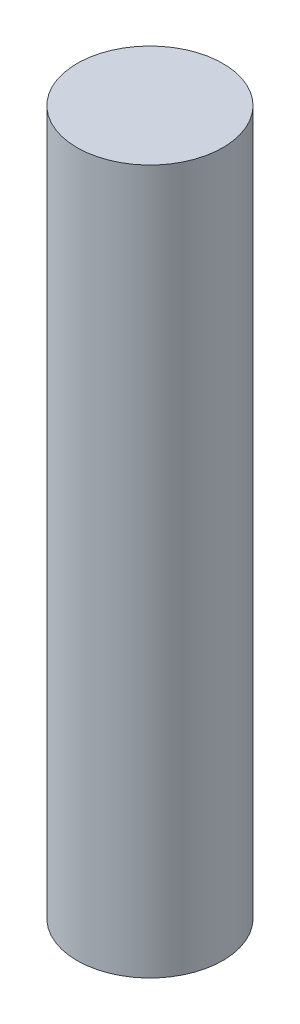
ISO-10303-21;
HEADER;
FILE_DESCRIPTION(('STEP AP214'),'2;1');
FILE_NAME('part.step','',(''),(''),'','','');
FILE_SCHEMA(('AUTOMOTIVE_DESIGN { 1 0 10303 214 1 1 1 1 }'));
ENDSEC;
DATA;
#1=APPLICATION_CONTEXT('core data for automotive mechanical design processes');
#2=APPLICATION_PROTOCOL_DEFINITION('international standard','automotive_design',2000,#1);
#3=PRODUCT_CONTEXT('',#1,'mechanical');
#4=PRODUCT('Part','Part','',(#3));
#5=PRODUCT_RELATED_PRODUCT_CATEGORY('part','',(#4));
#6=PRODUCT_DEFINITION_FORMATION('','',#4);
#7=PRODUCT_DEFINITION_CONTEXT('part definition',#1,'design');
#8=PRODUCT_DEFINITION('design','',#6,#7);
#9=PRODUCT_DEFINITION_SHAPE('','',#8);
#10=(LENGTH_UNIT() NAMED_UNIT(*) SI_UNIT(.MILLI.,.METRE.));
#11=(NAMED_UNIT(*) PLANE_ANGLE_UNIT() SI_UNIT($,.RADIAN.));
#12=(NAMED_UNIT(*) SI_UNIT($,.STERADIAN.) SOLID_ANGLE_UNIT());
#13=UNCERTAINTY_MEASURE_WITH_UNIT(LENGTH_MEASURE(1.E-05),#10,'distance_accuracy_value','');
#14=(GEOMETRIC_REPRESENTATION_CONTEXT(3) GLOBAL_UNCERTAINTY_ASSIGNED_CONTEXT((#13)) GLOBAL_UNIT_ASSIGNED_CONTEXT((#10,
#11,#12)) REPRESENTATION_CONTEXT('',''));
#15=CARTESIAN_POINT('',(0.,0.,0.));
#16=DIRECTION('',(0.,0.,1.));
#17=DIRECTION('',(1.,0.,0.));
#18=AXIS2_PLACEMENT_3D('',#15,#16,#17);
#19=CARTESIAN_POINT('',(0.,14.,0.));
#20=DIRECTION('',(0.,-1.,0.));
#21=DIRECTION('',(0.,0.,-1.));
#22=AXIS2_PLACEMENT_3D('',#19,#20,#21);
#23=CYLINDRICAL_SURFACE('',#22,1.45);
#24=CARTESIAN_POINT('',(0.,14.,0.));
#25=DIRECTION('',(0.,1.,0.));
#26=DIRECTION('',(0.,0.,1.));
#27=AXIS2_PLACEMENT_3D('',#24,#25,#26);
#28=CIRCLE('',#27,1.45);
#29=CARTESIAN_POINT('',(0.,14.,1.45));
#30=VERTEX_POINT('',#29);
#31=EDGE_CURVE('E10',#30,#30,#28,.T.);
#32=ORIENTED_EDGE('',*,*,#31,.F.);
#33=EDGE_LOOP('',(#32));
#34=FACE_BOUND('',#33,.T.);
#35=CARTESIAN_POINT('',(0.,0.,0.));
#36=DIRECTION('',(0.,1.,0.));
#37=DIRECTION('',(0.,0.,1.));
#38=AXIS2_PLACEMENT_3D('',#35,#36,#37);
#39=CIRCLE('',#38,1.45);
#40=CARTESIAN_POINT('',(0.,0.,1.45));
#41=VERTEX_POINT('',#40);
#42=EDGE_CURVE('E38',#41,#41,#39,.T.);
#43=ORIENTED_EDGE('',*,*,#42,.T.);
#44=EDGE_LOOP('',(#43));
#45=FACE_BOUND('',#44,.T.);
#46=ADVANCED_FACE('F35',(#34,#45),#23,.T.);
#47=CARTESIAN_POINT('',(0.,14.,0.));
#48=DIRECTION('',(0.,1.,0.));
#49=DIRECTION('',(0.,0.,1.));
#50=AXIS2_PLACEMENT_3D('',#47,#48,#49);
#51=PLANE('',#50);
#52=ORIENTED_EDGE('',*,*,#31,.T.);
#53=EDGE_LOOP('',(#52));
#54=FACE_BOUND('',#53,.T.);
#55=ADVANCED_FACE('F50',(#54),#51,.T.);
#56=CARTESIAN_POINT('',(0.,0.,0.));
#57=DIRECTION('',(0.,1.,0.));
#58=DIRECTION('',(0.,0.,1.));
#59=AXIS2_PLACEMENT_3D('',#56,#57,#58);
#60=PLANE('',#59);
#61=ORIENTED_EDGE('',*,*,#42,.F.);
#62=EDGE_LOOP('',(#61));
#63=FACE_BOUND('',#62,.T.);
#64=ADVANCED_FACE('F48',(#63),#60,.F.);
#65=CLOSED_SHELL('',(#46,#55,#64));
#66=MANIFOLD_SOLID_BREP('B2',#65);
#67=ADVANCED_BREP_SHAPE_REPRESENTATION('',(#18,#66),#14);
#68=SHAPE_DEFINITION_REPRESENTATION(#9,#67);
ENDSEC;
END-ISO-10303-21;
